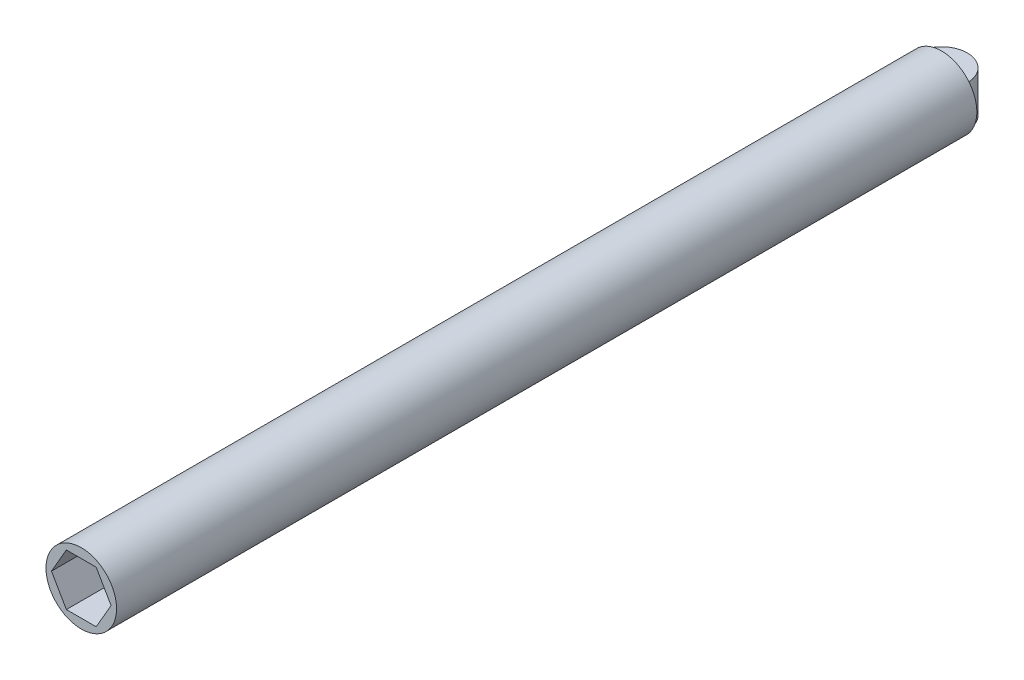
ISO-10303-21;
HEADER;
FILE_DESCRIPTION(('STEP AP214'),'2;1');
FILE_NAME('part.step','',(''),(''),'','','');
FILE_SCHEMA(('AUTOMOTIVE_DESIGN { 1 0 10303 214 1 1 1 1 }'));
ENDSEC;
DATA;
#1=APPLICATION_CONTEXT('core data for automotive mechanical design processes');
#2=APPLICATION_PROTOCOL_DEFINITION('international standard','automotive_design',2000,#1);
#3=PRODUCT_CONTEXT('',#1,'mechanical');
#4=PRODUCT('Part','Part','',(#3));
#5=PRODUCT_RELATED_PRODUCT_CATEGORY('part','',(#4));
#6=PRODUCT_DEFINITION_FORMATION('','',#4);
#7=PRODUCT_DEFINITION_CONTEXT('part definition',#1,'design');
#8=PRODUCT_DEFINITION('design','',#6,#7);
#9=PRODUCT_DEFINITION_SHAPE('','',#8);
#10=(LENGTH_UNIT() NAMED_UNIT(*) SI_UNIT(.MILLI.,.METRE.));
#11=(NAMED_UNIT(*) PLANE_ANGLE_UNIT() SI_UNIT($,.RADIAN.));
#12=(NAMED_UNIT(*) SI_UNIT($,.STERADIAN.) SOLID_ANGLE_UNIT());
#13=UNCERTAINTY_MEASURE_WITH_UNIT(LENGTH_MEASURE(1.E-05),#10,'distance_accuracy_value','');
#14=(GEOMETRIC_REPRESENTATION_CONTEXT(3) GLOBAL_UNCERTAINTY_ASSIGNED_CONTEXT((#13)) GLOBAL_UNIT_ASSIGNED_CONTEXT((#10,
#11,#12)) REPRESENTATION_CONTEXT('',''));
#15=CARTESIAN_POINT('',(0.,0.,0.));
#16=DIRECTION('',(0.,0.,1.));
#17=DIRECTION('',(1.,0.,0.));
#18=AXIS2_PLACEMENT_3D('',#15,#16,#17);
#19=CARTESIAN_POINT('',(0.,0.,-6.));
#20=DIRECTION('',(0.,0.,-1.));
#21=DIRECTION('',(-1.,0.,0.));
#22=AXIS2_PLACEMENT_3D('',#19,#20,#21);
#23=PLANE('',#22);
#24=CARTESIAN_POINT('',(0.,0.,-6.));
#25=DIRECTION('',(0.,0.,-1.));
#26=DIRECTION('',(-1.,0.,0.));
#27=AXIS2_PLACEMENT_3D('',#24,#25,#26);
#28=CIRCLE('',#27,1.025);
#29=CARTESIAN_POINT('',(-1.025,0.,-6.));
#30=VERTEX_POINT('',#29);
#31=EDGE_CURVE('E132',#30,#30,#28,.T.);
#32=ORIENTED_EDGE('',*,*,#31,.T.);
#33=EDGE_LOOP('',(#32));
#34=FACE_BOUND('',#33,.T.);
#35=DIRECTION('',(0.,1.,0.));
#36=VECTOR('',#35,1.);
#37=CARTESIAN_POINT('',(-0.75,-0.6,-6.));
#38=LINE('',#37,#36);
#39=CARTESIAN_POINT('',(-0.75,-0.6,-6.));
#40=VERTEX_POINT('',#39);
#41=CARTESIAN_POINT('',(-0.75,0.6,-6.));
#42=VERTEX_POINT('',#41);
#43=EDGE_CURVE('E63',#40,#42,#38,.T.);
#44=ORIENTED_EDGE('',*,*,#43,.F.);
#45=DIRECTION('',(1.,0.,0.));
#46=VECTOR('',#45,1.);
#47=CARTESIAN_POINT('',(0.,-0.6,-6.));
#48=LINE('',#47,#46);
#49=CARTESIAN_POINT('',(0.75,-0.6,-6.));
#50=VERTEX_POINT('',#49);
#51=EDGE_CURVE('E67',#40,#50,#48,.T.);
#52=ORIENTED_EDGE('',*,*,#51,.T.);
#53=DIRECTION('',(0.,1.,0.));
#54=VECTOR('',#53,1.);
#55=CARTESIAN_POINT('',(0.75,-0.6,-6.));
#56=LINE('',#55,#54);
#57=CARTESIAN_POINT('',(0.75,0.6,-6.));
#58=VERTEX_POINT('',#57);
#59=EDGE_CURVE('E107',#50,#58,#56,.T.);
#60=ORIENTED_EDGE('',*,*,#59,.T.);
#61=DIRECTION('',(1.,0.,0.));
#62=VECTOR('',#61,1.);
#63=CARTESIAN_POINT('',(0.,0.6,-6.));
#64=LINE('',#63,#62);
#65=EDGE_CURVE('E110',#42,#58,#64,.T.);
#66=ORIENTED_EDGE('',*,*,#65,.F.);
#67=EDGE_LOOP('',(#44,#52,#60,#66));
#68=FACE_BOUND('',#67,.T.);
#69=ADVANCED_FACE('F45',(#34,#68),#23,.T.);
#70=CARTESIAN_POINT('',(0.649519052838329,-0.375,5.));
#71=DIRECTION('',(0.866025403784439,-0.5,0.));
#72=DIRECTION('',(0.5,0.866025403784439,0.));
#73=AXIS2_PLACEMENT_3D('',#70,#71,#72);
#74=PLANE('',#73);
#75=DIRECTION('',(0.,0.,1.));
#76=VECTOR('',#75,1.);
#77=CARTESIAN_POINT('',(0.43301270189222,-0.75,5.));
#78=LINE('',#77,#76);
#79=CARTESIAN_POINT('',(0.43301270189222,-0.75,5.));
#80=VERTEX_POINT('',#79);
#81=CARTESIAN_POINT('',(0.433012701892229,-0.749999999999995,19.));
#82=VERTEX_POINT('',#81);
#83=EDGE_CURVE('E11',#80,#82,#78,.T.);
#84=ORIENTED_EDGE('',*,*,#83,.T.);
#85=DIRECTION('',(0.499999999999995,0.866025403784442,0.));
#86=VECTOR('',#85,1.);
#87=CARTESIAN_POINT('',(0.433012701892229,-0.749999999999995,19.));
#88=LINE('',#87,#86);
#89=CARTESIAN_POINT('',(0.866025403784439,0.,19.));
#90=VERTEX_POINT('',#89);
#91=EDGE_CURVE('E137',#82,#90,#88,.T.);
#92=ORIENTED_EDGE('',*,*,#91,.T.);
#93=DIRECTION('',(0.,0.,1.));
#94=VECTOR('',#93,1.);
#95=CARTESIAN_POINT('',(0.866025403784439,0.,5.));
#96=LINE('',#95,#94);
#97=CARTESIAN_POINT('',(0.866025403784439,0.,5.));
#98=VERTEX_POINT('',#97);
#99=EDGE_CURVE('E49',#98,#90,#96,.T.);
#100=ORIENTED_EDGE('',*,*,#99,.F.);
#101=DIRECTION('',(0.5,0.866025403784439,0.));
#102=VECTOR('',#101,1.);
#103=CARTESIAN_POINT('',(0.649519052838329,-0.375,5.));
#104=LINE('',#103,#102);
#105=EDGE_CURVE('E165',#80,#98,#104,.T.);
#106=ORIENTED_EDGE('',*,*,#105,.F.);
#107=EDGE_LOOP('',(#84,#92,#100,#106));
#108=FACE_BOUND('',#107,.T.);
#109=ADVANCED_FACE('F209',(#108),#74,.F.);
#110=CARTESIAN_POINT('',(0.,-0.75,5.));
#111=DIRECTION('',(0.,-1.,0.));
#112=DIRECTION('',(0.,0.,-1.));
#113=AXIS2_PLACEMENT_3D('',#110,#111,#112);
#114=PLANE('',#113);
#115=DIRECTION('',(0.,0.,1.));
#116=VECTOR('',#115,1.);
#117=CARTESIAN_POINT('',(-0.433012701892219,-0.75,5.));
#118=LINE('',#117,#116);
#119=CARTESIAN_POINT('',(-0.433012701892219,-0.75,5.));
#120=VERTEX_POINT('',#119);
#121=CARTESIAN_POINT('',(-0.433012701892213,-0.750000000000005,19.));
#122=VERTEX_POINT('',#121);
#123=EDGE_CURVE('E55',#120,#122,#118,.T.);
#124=ORIENTED_EDGE('',*,*,#123,.T.);
#125=DIRECTION('',(1.,0.,0.));
#126=VECTOR('',#125,1.);
#127=CARTESIAN_POINT('',(-0.433012701892213,-0.750000000000005,19.));
#128=LINE('',#127,#126);
#129=EDGE_CURVE('E157',#122,#82,#128,.T.);
#130=ORIENTED_EDGE('',*,*,#129,.T.);
#131=ORIENTED_EDGE('',*,*,#83,.F.);
#132=DIRECTION('',(1.,0.,0.));
#133=VECTOR('',#132,1.);
#134=CARTESIAN_POINT('',(0.,-0.75,5.));
#135=LINE('',#134,#133);
#136=EDGE_CURVE('E185',#120,#80,#135,.T.);
#137=ORIENTED_EDGE('',*,*,#136,.F.);
#138=EDGE_LOOP('',(#124,#130,#131,#137));
#139=FACE_BOUND('',#138,.T.);
#140=ADVANCED_FACE('F224',(#139),#114,.F.);
#141=CARTESIAN_POINT('',(-0.649519052838329,-0.375,5.));
#142=DIRECTION('',(-0.866025403784439,-0.5,0.));
#143=DIRECTION('',(0.5,-0.866025403784439,0.));
#144=AXIS2_PLACEMENT_3D('',#141,#142,#143);
#145=PLANE('',#144);
#146=DIRECTION('',(0.,0.,1.));
#147=VECTOR('',#146,1.);
#148=CARTESIAN_POINT('',(-0.866025403784439,0.,5.));
#149=LINE('',#148,#147);
#150=CARTESIAN_POINT('',(-0.866025403784439,0.,5.));
#151=VERTEX_POINT('',#150);
#152=CARTESIAN_POINT('',(-0.866025403784439,0.,19.));
#153=VERTEX_POINT('',#152);
#154=EDGE_CURVE('E191',#151,#153,#149,.T.);
#155=ORIENTED_EDGE('',*,*,#154,.T.);
#156=DIRECTION('',(0.500000000000007,-0.866025403784434,0.));
#157=VECTOR('',#156,1.);
#158=CARTESIAN_POINT('',(-0.866025403784439,0.,19.));
#159=LINE('',#158,#157);
#160=EDGE_CURVE('E153',#153,#122,#159,.T.);
#161=ORIENTED_EDGE('',*,*,#160,.T.);
#162=ORIENTED_EDGE('',*,*,#123,.F.);
#163=DIRECTION('',(0.5,-0.866025403784439,0.));
#164=VECTOR('',#163,1.);
#165=CARTESIAN_POINT('',(-0.649519052838329,-0.375,5.));
#166=LINE('',#165,#164);
#167=EDGE_CURVE('E181',#151,#120,#166,.T.);
#168=ORIENTED_EDGE('',*,*,#167,.F.);
#169=EDGE_LOOP('',(#155,#161,#162,#168));
#170=FACE_BOUND('',#169,.T.);
#171=ADVANCED_FACE('F226',(#170),#145,.F.);
#172=CARTESIAN_POINT('',(-0.64951905283833,0.375,5.));
#173=DIRECTION('',(-0.866025403784439,0.5,0.));
#174=DIRECTION('',(-0.5,-0.866025403784439,0.));
#175=AXIS2_PLACEMENT_3D('',#172,#173,#174);
#176=PLANE('',#175);
#177=DIRECTION('',(0.,0.,1.));
#178=VECTOR('',#177,1.);
#179=CARTESIAN_POINT('',(-0.43301270189222,0.75,5.));
#180=LINE('',#179,#178);
#181=CARTESIAN_POINT('',(-0.43301270189222,0.75,5.));
#182=VERTEX_POINT('',#181);
#183=CARTESIAN_POINT('',(-0.433012701892223,0.749999999999999,19.));
#184=VERTEX_POINT('',#183);
#185=EDGE_CURVE('E194',#182,#184,#180,.T.);
#186=ORIENTED_EDGE('',*,*,#185,.T.);
#187=DIRECTION('',(-0.499999999999995,-0.866025403784442,0.));
#188=VECTOR('',#187,1.);
#189=CARTESIAN_POINT('',(-0.433012701892223,0.749999999999999,19.));
#190=LINE('',#189,#188);
#191=EDGE_CURVE('E149',#184,#153,#190,.T.);
#192=ORIENTED_EDGE('',*,*,#191,.T.);
#193=ORIENTED_EDGE('',*,*,#154,.F.);
#194=DIRECTION('',(-0.5,-0.866025403784439,0.));
#195=VECTOR('',#194,1.);
#196=CARTESIAN_POINT('',(-0.64951905283833,0.375,5.));
#197=LINE('',#196,#195);
#198=EDGE_CURVE('E177',#182,#151,#197,.T.);
#199=ORIENTED_EDGE('',*,*,#198,.F.);
#200=EDGE_LOOP('',(#186,#192,#193,#199));
#201=FACE_BOUND('',#200,.T.);
#202=ADVANCED_FACE('F218',(#201),#176,.F.);
#203=CARTESIAN_POINT('',(0.,0.750000000000001,5.));
#204=DIRECTION('',(0.,1.,0.));
#205=DIRECTION('',(-1.,0.,0.));
#206=AXIS2_PLACEMENT_3D('',#203,#204,#205);
#207=PLANE('',#206);
#208=DIRECTION('',(0.,0.,1.));
#209=VECTOR('',#208,1.);
#210=CARTESIAN_POINT('',(0.43301270189222,0.750000000000001,5.));
#211=LINE('',#210,#209);
#212=CARTESIAN_POINT('',(0.43301270189222,0.750000000000001,5.));
#213=VERTEX_POINT('',#212);
#214=CARTESIAN_POINT('',(0.433012701892218,0.750000000000002,19.));
#215=VERTEX_POINT('',#214);
#216=EDGE_CURVE('E196',#213,#215,#211,.T.);
#217=ORIENTED_EDGE('',*,*,#216,.T.);
#218=DIRECTION('',(-1.,0.,0.));
#219=VECTOR('',#218,1.);
#220=CARTESIAN_POINT('',(0.433012701892218,0.750000000000002,19.));
#221=LINE('',#220,#219);
#222=EDGE_CURVE('E145',#215,#184,#221,.T.);
#223=ORIENTED_EDGE('',*,*,#222,.T.);
#224=ORIENTED_EDGE('',*,*,#185,.F.);
#225=DIRECTION('',(-1.,0.,0.));
#226=VECTOR('',#225,1.);
#227=CARTESIAN_POINT('',(0.,0.750000000000001,5.));
#228=LINE('',#227,#226);
#229=EDGE_CURVE('E173',#213,#182,#228,.T.);
#230=ORIENTED_EDGE('',*,*,#229,.F.);
#231=EDGE_LOOP('',(#217,#223,#224,#230));
#232=FACE_BOUND('',#231,.T.);
#233=ADVANCED_FACE('F215',(#232),#207,.F.);
#234=CARTESIAN_POINT('',(0.649519052838329,0.375,5.));
#235=DIRECTION('',(0.866025403784439,0.5,0.));
#236=DIRECTION('',(-0.5,0.866025403784439,0.));
#237=AXIS2_PLACEMENT_3D('',#234,#235,#236);
#238=PLANE('',#237);
#239=ORIENTED_EDGE('',*,*,#99,.T.);
#240=DIRECTION('',(-0.500000000000001,0.866025403784438,0.));
#241=VECTOR('',#240,1.);
#242=CARTESIAN_POINT('',(0.866025403784439,0.,19.));
#243=LINE('',#242,#241);
#244=EDGE_CURVE('E141',#90,#215,#243,.T.);
#245=ORIENTED_EDGE('',*,*,#244,.T.);
#246=ORIENTED_EDGE('',*,*,#216,.F.);
#247=DIRECTION('',(-0.5,0.866025403784439,0.));
#248=VECTOR('',#247,1.);
#249=CARTESIAN_POINT('',(0.649519052838329,0.375,5.));
#250=LINE('',#249,#248);
#251=EDGE_CURVE('E169',#98,#213,#250,.T.);
#252=ORIENTED_EDGE('',*,*,#251,.F.);
#253=EDGE_LOOP('',(#239,#245,#246,#252));
#254=FACE_BOUND('',#253,.T.);
#255=ADVANCED_FACE('F203',(#254),#238,.F.);
#256=CARTESIAN_POINT('',(0.,0.,5.));
#257=DIRECTION('',(0.,0.,1.));
#258=DIRECTION('',(1.,0.,0.));
#259=AXIS2_PLACEMENT_3D('',#256,#257,#258);
#260=PLANE('',#259);
#261=ORIENTED_EDGE('',*,*,#105,.T.);
#262=ORIENTED_EDGE('',*,*,#251,.T.);
#263=ORIENTED_EDGE('',*,*,#229,.T.);
#264=ORIENTED_EDGE('',*,*,#198,.T.);
#265=ORIENTED_EDGE('',*,*,#167,.T.);
#266=ORIENTED_EDGE('',*,*,#136,.T.);
#267=EDGE_LOOP('',(#261,#262,#263,#264,#265,#266));
#268=FACE_BOUND('',#267,.T.);
#269=ADVANCED_FACE('F221',(#268),#260,.T.);
#270=CARTESIAN_POINT('',(0.,0.,19.));
#271=DIRECTION('',(0.,0.,1.));
#272=DIRECTION('',(1.,0.,0.));
#273=AXIS2_PLACEMENT_3D('',#270,#271,#272);
#274=PLANE('',#273);
#275=CARTESIAN_POINT('',(0.,0.,19.));
#276=DIRECTION('',(0.,0.,1.));
#277=DIRECTION('',(1.,0.,0.));
#278=AXIS2_PLACEMENT_3D('',#275,#276,#277);
#279=CIRCLE('',#278,1.025);
#280=CARTESIAN_POINT('',(1.025,0.,19.));
#281=VERTEX_POINT('',#280);
#282=EDGE_CURVE('E161',#281,#281,#279,.T.);
#283=ORIENTED_EDGE('',*,*,#282,.T.);
#284=EDGE_LOOP('',(#283));
#285=FACE_BOUND('',#284,.T.);
#286=ORIENTED_EDGE('',*,*,#244,.F.);
#287=ORIENTED_EDGE('',*,*,#91,.F.);
#288=ORIENTED_EDGE('',*,*,#129,.F.);
#289=ORIENTED_EDGE('',*,*,#160,.F.);
#290=ORIENTED_EDGE('',*,*,#191,.F.);
#291=ORIENTED_EDGE('',*,*,#222,.F.);
#292=EDGE_LOOP('',(#286,#287,#288,#289,#290,#291));
#293=FACE_BOUND('',#292,.T.);
#294=ADVANCED_FACE('F212',(#285,#293),#274,.T.);
#295=CARTESIAN_POINT('',(0.,0.,12.));
#296=DIRECTION('',(0.,0.,-1.));
#297=DIRECTION('',(-1.,0.,0.));
#298=AXIS2_PLACEMENT_3D('',#295,#296,#297);
#299=CYLINDRICAL_SURFACE('',#298,1.025);
#300=ORIENTED_EDGE('',*,*,#282,.F.);
#301=EDGE_LOOP('',(#300));
#302=FACE_BOUND('',#301,.T.);
#303=ORIENTED_EDGE('',*,*,#31,.F.);
#304=EDGE_LOOP('',(#303));
#305=FACE_BOUND('',#304,.T.);
#306=ADVANCED_FACE('F47',(#302,#305),#299,.T.);
#307=CARTESIAN_POINT('',(0.,-0.6,-6.));
#308=DIRECTION('',(0.,1.,0.));
#309=DIRECTION('',(0.,0.,1.));
#310=AXIS2_PLACEMENT_3D('',#307,#308,#309);
#311=CYLINDRICAL_SURFACE('',#310,0.75);
#312=ORIENTED_EDGE('',*,*,#43,.T.);
#313=CARTESIAN_POINT('',(0.,0.6,-6.));
#314=DIRECTION('',(0.,1.,0.));
#315=DIRECTION('',(0.,0.,1.));
#316=AXIS2_PLACEMENT_3D('',#313,#314,#315);
#317=CIRCLE('',#316,0.75);
#318=EDGE_CURVE('E118',#58,#42,#317,.T.);
#319=ORIENTED_EDGE('',*,*,#318,.F.);
#320=ORIENTED_EDGE('',*,*,#59,.F.);
#321=CARTESIAN_POINT('',(0.,-0.6,-6.));
#322=DIRECTION('',(0.,1.,0.));
#323=DIRECTION('',(0.,0.,1.));
#324=AXIS2_PLACEMENT_3D('',#321,#322,#323);
#325=CIRCLE('',#324,0.75);
#326=EDGE_CURVE('E115',#50,#40,#325,.T.);
#327=ORIENTED_EDGE('',*,*,#326,.T.);
#328=EDGE_LOOP('',(#312,#319,#320,#327));
#329=FACE_BOUND('',#328,.T.);
#330=ADVANCED_FACE('F119',(#329),#311,.T.);
#331=CARTESIAN_POINT('',(0.,-0.6,0.));
#332=DIRECTION('',(0.,1.,0.));
#333=DIRECTION('',(0.,0.,1.));
#334=AXIS2_PLACEMENT_3D('',#331,#332,#333);
#335=PLANE('',#334);
#336=ORIENTED_EDGE('',*,*,#51,.F.);
#337=ORIENTED_EDGE('',*,*,#326,.F.);
#338=EDGE_LOOP('',(#336,#337));
#339=FACE_BOUND('',#338,.T.);
#340=ADVANCED_FACE('F361',(#339),#335,.F.);
#341=CARTESIAN_POINT('',(0.,0.6,0.));
#342=DIRECTION('',(0.,1.,0.));
#343=DIRECTION('',(0.,0.,1.));
#344=AXIS2_PLACEMENT_3D('',#341,#342,#343);
#345=PLANE('',#344);
#346=ORIENTED_EDGE('',*,*,#65,.T.);
#347=ORIENTED_EDGE('',*,*,#318,.T.);
#348=EDGE_LOOP('',(#346,#347));
#349=FACE_BOUND('',#348,.T.);
#350=ADVANCED_FACE('F123',(#349),#345,.T.);
#351=CLOSED_SHELL('',(#69,#109,#140,#171,#202,#233,#255,#269,#294,#306,#330,#340,#350));
#352=MANIFOLD_SOLID_BREP('B2',#351);
#353=ADVANCED_BREP_SHAPE_REPRESENTATION('',(#18,#352),#14);
#354=SHAPE_DEFINITION_REPRESENTATION(#9,#353);
ENDSEC;
END-ISO-10303-21;
